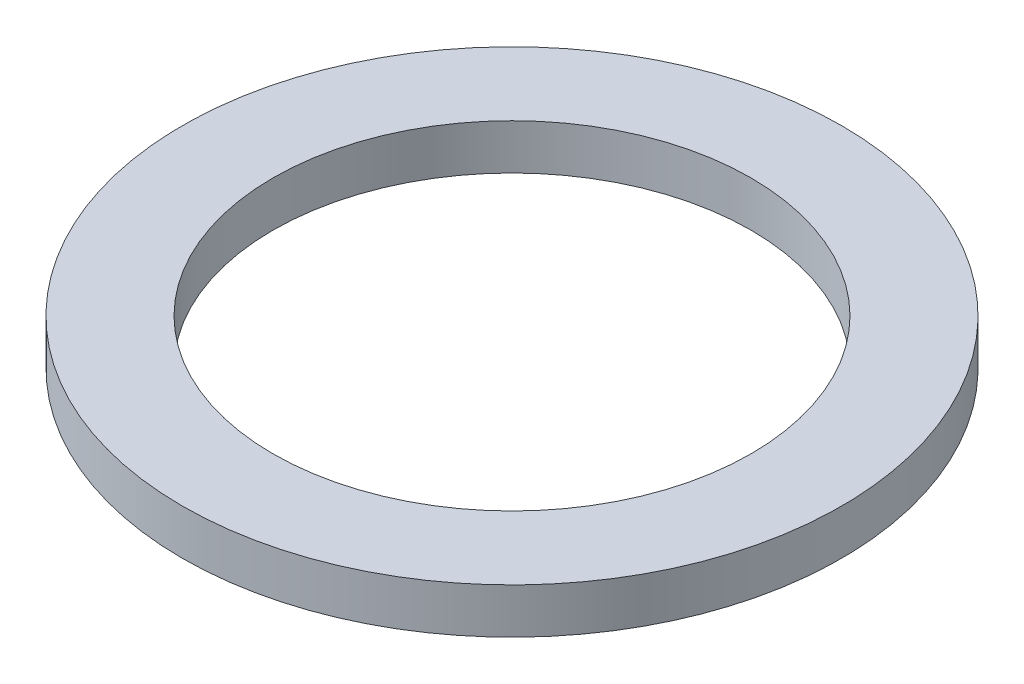
ISO-10303-21;
HEADER;
FILE_DESCRIPTION(('STEP AP214'),'2;1');
FILE_NAME('part.step','',(''),(''),'','','');
FILE_SCHEMA(('AUTOMOTIVE_DESIGN { 1 0 10303 214 1 1 1 1 }'));
ENDSEC;
DATA;
#1=APPLICATION_CONTEXT('core data for automotive mechanical design processes');
#2=APPLICATION_PROTOCOL_DEFINITION('international standard','automotive_design',2000,#1);
#3=PRODUCT_CONTEXT('',#1,'mechanical');
#4=PRODUCT('Part','Part','',(#3));
#5=PRODUCT_RELATED_PRODUCT_CATEGORY('part','',(#4));
#6=PRODUCT_DEFINITION_FORMATION('','',#4);
#7=PRODUCT_DEFINITION_CONTEXT('part definition',#1,'design');
#8=PRODUCT_DEFINITION('design','',#6,#7);
#9=PRODUCT_DEFINITION_SHAPE('','',#8);
#10=(LENGTH_UNIT() NAMED_UNIT(*) SI_UNIT(.MILLI.,.METRE.));
#11=(NAMED_UNIT(*) PLANE_ANGLE_UNIT() SI_UNIT($,.RADIAN.));
#12=(NAMED_UNIT(*) SI_UNIT($,.STERADIAN.) SOLID_ANGLE_UNIT());
#13=UNCERTAINTY_MEASURE_WITH_UNIT(LENGTH_MEASURE(1.E-05),#10,'distance_accuracy_value','');
#14=(GEOMETRIC_REPRESENTATION_CONTEXT(3) GLOBAL_UNCERTAINTY_ASSIGNED_CONTEXT((#13)) GLOBAL_UNIT_ASSIGNED_CONTEXT((#10,
#11,#12)) REPRESENTATION_CONTEXT('',''));
#15=CARTESIAN_POINT('',(0.,0.,0.));
#16=DIRECTION('',(0.,0.,1.));
#17=DIRECTION('',(1.,0.,0.));
#18=AXIS2_PLACEMENT_3D('',#15,#16,#17);
#19=CARTESIAN_POINT('',(0.,273.977978151893,-26.3877562004189));
#20=DIRECTION('',(0.,1.,0.));
#21=DIRECTION('',(0.,0.,1.));
#22=AXIS2_PLACEMENT_3D('',#19,#20,#21);
#23=PLANE('',#22);
#24=CARTESIAN_POINT('',(0.,273.977978151893,9.56588997971305E-13));
#25=DIRECTION('',(0.,-1.,0.));
#26=DIRECTION('',(0.,0.,-1.));
#27=AXIS2_PLACEMENT_3D('',#24,#25,#26);
#28=CIRCLE('',#27,26.3877562004198);
#29=CARTESIAN_POINT('',(0.,273.977978151893,-26.3877562004189));
#30=VERTEX_POINT('',#29);
#31=EDGE_CURVE('E10',#30,#30,#28,.T.);
#32=ORIENTED_EDGE('',*,*,#31,.T.);
#33=EDGE_LOOP('',(#32));
#34=FACE_BOUND('',#33,.T.);
#35=CARTESIAN_POINT('',(0.,273.977978151893,9.56588997971305E-13));
#36=DIRECTION('',(0.,-1.,0.));
#37=DIRECTION('',(0.,0.,-1.));
#38=AXIS2_PLACEMENT_3D('',#35,#36,#37);
#39=CIRCLE('',#38,36.3857181832405);
#40=CARTESIAN_POINT('',(0.,273.977978151893,-36.3857181832395));
#41=VERTEX_POINT('',#40);
#42=EDGE_CURVE('E46',#41,#41,#39,.T.);
#43=ORIENTED_EDGE('',*,*,#42,.F.);
#44=EDGE_LOOP('',(#43));
#45=FACE_BOUND('',#44,.T.);
#46=ADVANCED_FACE('F32',(#34,#45),#23,.T.);
#47=CARTESIAN_POINT('',(0.,0.,0.));
#48=DIRECTION('',(0.,-1.,0.));
#49=DIRECTION('',(0.,0.,-1.));
#50=AXIS2_PLACEMENT_3D('',#47,#48,#49);
#51=CYLINDRICAL_SURFACE('',#50,26.3877562004198);
#52=CARTESIAN_POINT('',(0.,268.97797815188,9.39131591277045E-13));
#53=DIRECTION('',(0.,-1.,0.));
#54=DIRECTION('',(0.,0.,-1.));
#55=AXIS2_PLACEMENT_3D('',#52,#53,#54);
#56=CIRCLE('',#55,26.3877562004198);
#57=CARTESIAN_POINT('',(0.,268.97797815188,-26.3877562004189));
#58=VERTEX_POINT('',#57);
#59=EDGE_CURVE('E38',#58,#58,#56,.T.);
#60=ORIENTED_EDGE('',*,*,#59,.T.);
#61=EDGE_LOOP('',(#60));
#62=FACE_BOUND('',#61,.T.);
#63=ORIENTED_EDGE('',*,*,#31,.F.);
#64=EDGE_LOOP('',(#63));
#65=FACE_BOUND('',#64,.T.);
#66=ADVANCED_FACE('F56',(#62,#65),#51,.F.);
#67=CARTESIAN_POINT('',(0.,268.97797815188,-26.3877562004189));
#68=DIRECTION('',(0.,-1.,0.));
#69=DIRECTION('',(0.,0.,-1.));
#70=AXIS2_PLACEMENT_3D('',#67,#68,#69);
#71=PLANE('',#70);
#72=CARTESIAN_POINT('',(0.,268.97797815188,9.39131591277045E-13));
#73=DIRECTION('',(0.,-1.,0.));
#74=DIRECTION('',(0.,0.,-1.));
#75=AXIS2_PLACEMENT_3D('',#72,#73,#74);
#76=CIRCLE('',#75,36.3857181832404);
#77=CARTESIAN_POINT('',(0.,268.97797815188,-36.3857181832395));
#78=VERTEX_POINT('',#77);
#79=EDGE_CURVE('E42',#78,#78,#76,.T.);
#80=ORIENTED_EDGE('',*,*,#79,.T.);
#81=EDGE_LOOP('',(#80));
#82=FACE_BOUND('',#81,.T.);
#83=ORIENTED_EDGE('',*,*,#59,.F.);
#84=EDGE_LOOP('',(#83));
#85=FACE_BOUND('',#84,.T.);
#86=ADVANCED_FACE('F60',(#82,#85),#71,.T.);
#87=CARTESIAN_POINT('',(0.,0.,0.));
#88=DIRECTION('',(0.,-1.,0.));
#89=DIRECTION('',(0.,0.,-1.));
#90=AXIS2_PLACEMENT_3D('',#87,#88,#89);
#91=CYLINDRICAL_SURFACE('',#90,36.3857181832404);
#92=ORIENTED_EDGE('',*,*,#42,.T.);
#93=EDGE_LOOP('',(#92));
#94=FACE_BOUND('',#93,.T.);
#95=ORIENTED_EDGE('',*,*,#79,.F.);
#96=EDGE_LOOP('',(#95));
#97=FACE_BOUND('',#96,.T.);
#98=ADVANCED_FACE('F52',(#94,#97),#91,.T.);
#99=CLOSED_SHELL('',(#46,#66,#86,#98));
#100=MANIFOLD_SOLID_BREP('B2',#99);
#101=ADVANCED_BREP_SHAPE_REPRESENTATION('',(#18,#100),#14);
#102=SHAPE_DEFINITION_REPRESENTATION(#9,#101);
ENDSEC;
END-ISO-10303-21;
